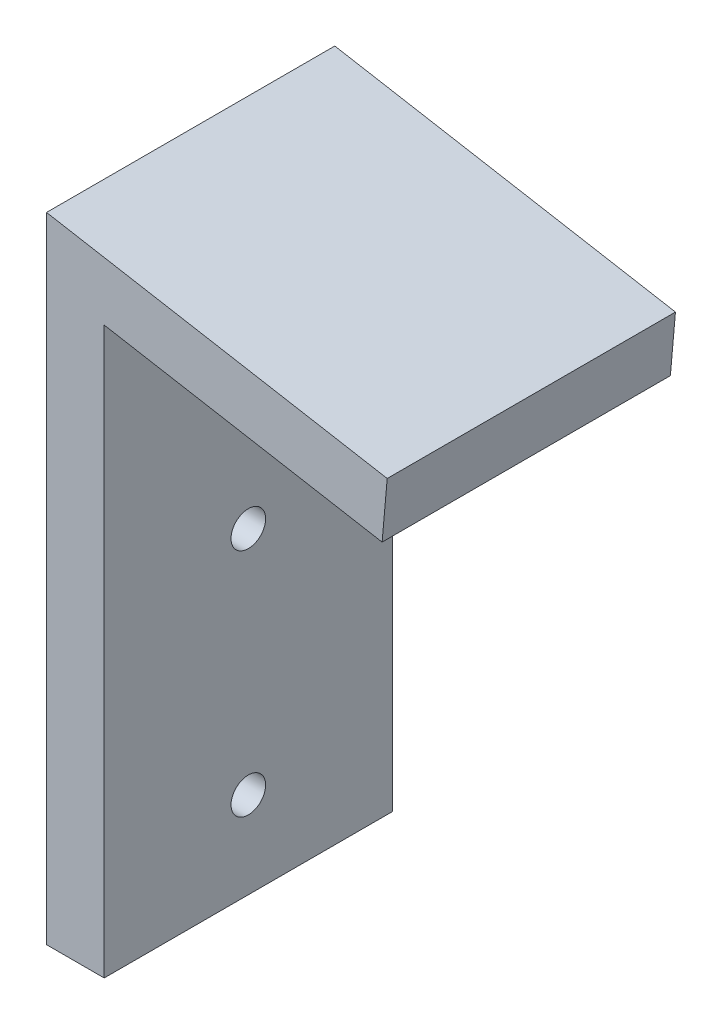
ISO-10303-21;
HEADER;
FILE_DESCRIPTION(('STEP AP214'),'2;1');
FILE_NAME('part.step','',(''),(''),'','','');
FILE_SCHEMA(('AUTOMOTIVE_DESIGN { 1 0 10303 214 1 1 1 1 }'));
ENDSEC;
DATA;
#1=APPLICATION_CONTEXT('core data for automotive mechanical design processes');
#2=APPLICATION_PROTOCOL_DEFINITION('international standard','automotive_design',2000,#1);
#3=PRODUCT_CONTEXT('',#1,'mechanical');
#4=PRODUCT('Part','Part','',(#3));
#5=PRODUCT_RELATED_PRODUCT_CATEGORY('part','',(#4));
#6=PRODUCT_DEFINITION_FORMATION('','',#4);
#7=PRODUCT_DEFINITION_CONTEXT('part definition',#1,'design');
#8=PRODUCT_DEFINITION('design','',#6,#7);
#9=PRODUCT_DEFINITION_SHAPE('','',#8);
#10=(LENGTH_UNIT() NAMED_UNIT(*) SI_UNIT(.MILLI.,.METRE.));
#11=(NAMED_UNIT(*) PLANE_ANGLE_UNIT() SI_UNIT($,.RADIAN.));
#12=(NAMED_UNIT(*) SI_UNIT($,.STERADIAN.) SOLID_ANGLE_UNIT());
#13=UNCERTAINTY_MEASURE_WITH_UNIT(LENGTH_MEASURE(1.E-05),#10,'distance_accuracy_value','');
#14=(GEOMETRIC_REPRESENTATION_CONTEXT(3) GLOBAL_UNCERTAINTY_ASSIGNED_CONTEXT((#13)) GLOBAL_UNIT_ASSIGNED_CONTEXT((#10,
#11,#12)) REPRESENTATION_CONTEXT('',''));
#15=CARTESIAN_POINT('',(0.,0.,0.));
#16=DIRECTION('',(0.,0.,1.));
#17=DIRECTION('',(1.,0.,0.));
#18=AXIS2_PLACEMENT_3D('',#15,#16,#17);
#19=CARTESIAN_POINT('',(59.0884651807324,-10.4188906600161,50.));
#20=DIRECTION('',(-0.173648177666934,-0.984807753012207,0.));
#21=DIRECTION('',(0.984807753012207,-0.173648177666934,0.));
#22=AXIS2_PLACEMENT_3D('',#19,#20,#21);
#23=PLANE('',#22);
#24=DIRECTION('',(-0.984807753012207,0.173648177666934,0.));
#25=VECTOR('',#24,1.);
#26=CARTESIAN_POINT('',(59.0884651807324,-10.4188906600161,0.));
#27=LINE('',#26,#25);
#28=CARTESIAN_POINT('',(59.0884651807324,-10.4188906600161,0.));
#29=VERTEX_POINT('',#28);
#30=CARTESIAN_POINT('',(0.,0.,0.));
#31=VERTEX_POINT('',#30);
#32=EDGE_CURVE('E120',#29,#31,#27,.T.);
#33=ORIENTED_EDGE('',*,*,#32,.T.);
#34=DIRECTION('',(0.,0.,-1.));
#35=VECTOR('',#34,1.);
#36=CARTESIAN_POINT('',(0.,0.,50.));
#37=LINE('',#36,#35);
#38=CARTESIAN_POINT('',(0.,0.,50.));
#39=VERTEX_POINT('',#38);
#40=EDGE_CURVE('E11',#39,#31,#37,.T.);
#41=ORIENTED_EDGE('',*,*,#40,.F.);
#42=DIRECTION('',(-0.984807753012207,0.173648177666934,0.));
#43=VECTOR('',#42,1.);
#44=CARTESIAN_POINT('',(59.0884651807324,-10.4188906600161,50.));
#45=LINE('',#44,#43);
#46=CARTESIAN_POINT('',(59.0884651807324,-10.4188906600161,50.));
#47=VERTEX_POINT('',#46);
#48=EDGE_CURVE('E131',#47,#39,#45,.T.);
#49=ORIENTED_EDGE('',*,*,#48,.F.);
#50=DIRECTION('',(0.,0.,-1.));
#51=VECTOR('',#50,1.);
#52=CARTESIAN_POINT('',(59.0884651807324,-10.4188906600161,50.));
#53=LINE('',#52,#51);
#54=EDGE_CURVE('E116',#47,#29,#53,.T.);
#55=ORIENTED_EDGE('',*,*,#54,.T.);
#56=EDGE_LOOP('',(#33,#41,#49,#55));
#57=FACE_BOUND('',#56,.T.);
#58=ADVANCED_FACE('F36',(#57),#23,.F.);
#59=CARTESIAN_POINT('',(0.,0.,50.));
#60=DIRECTION('',(1.,0.,0.));
#61=DIRECTION('',(0.,1.,0.));
#62=AXIS2_PLACEMENT_3D('',#59,#60,#61);
#63=PLANE('',#62);
#64=CARTESIAN_POINT('',(0.,-95.,25.));
#65=DIRECTION('',(-1.,0.,0.));
#66=DIRECTION('',(0.,-1.,0.));
#67=AXIS2_PLACEMENT_3D('',#64,#65,#66);
#68=CIRCLE('',#67,3.00000000000001);
#69=CARTESIAN_POINT('',(0.,-98.,25.));
#70=VERTEX_POINT('',#69);
#71=EDGE_CURVE('E178',#70,#70,#68,.T.);
#72=ORIENTED_EDGE('',*,*,#71,.F.);
#73=EDGE_LOOP('',(#72));
#74=FACE_BOUND('',#73,.T.);
#75=CARTESIAN_POINT('',(0.,-55.,25.));
#76=DIRECTION('',(-1.,0.,0.));
#77=DIRECTION('',(0.,-1.,0.));
#78=AXIS2_PLACEMENT_3D('',#75,#76,#77);
#79=CIRCLE('',#78,3.00000000000001);
#80=CARTESIAN_POINT('',(0.,-58.,25.));
#81=VERTEX_POINT('',#80);
#82=EDGE_CURVE('E179',#81,#81,#79,.T.);
#83=ORIENTED_EDGE('',*,*,#82,.F.);
#84=EDGE_LOOP('',(#83));
#85=FACE_BOUND('',#84,.T.);
#86=DIRECTION('',(0.,-1.,0.));
#87=VECTOR('',#86,1.);
#88=CARTESIAN_POINT('',(0.,0.,0.));
#89=LINE('',#88,#87);
#90=CARTESIAN_POINT('',(0.,-110.,0.));
#91=VERTEX_POINT('',#90);
#92=EDGE_CURVE('E123',#31,#91,#89,.T.);
#93=ORIENTED_EDGE('',*,*,#92,.T.);
#94=DIRECTION('',(0.,0.,-1.));
#95=VECTOR('',#94,1.);
#96=CARTESIAN_POINT('',(0.,-110.,50.));
#97=LINE('',#96,#95);
#98=CARTESIAN_POINT('',(0.,-110.,50.));
#99=VERTEX_POINT('',#98);
#100=EDGE_CURVE('E44',#99,#91,#97,.T.);
#101=ORIENTED_EDGE('',*,*,#100,.F.);
#102=DIRECTION('',(0.,-1.,0.));
#103=VECTOR('',#102,1.);
#104=CARTESIAN_POINT('',(0.,0.,50.));
#105=LINE('',#104,#103);
#106=EDGE_CURVE('E89',#39,#99,#105,.T.);
#107=ORIENTED_EDGE('',*,*,#106,.F.);
#108=ORIENTED_EDGE('',*,*,#40,.T.);
#109=EDGE_LOOP('',(#93,#101,#107,#108));
#110=FACE_BOUND('',#109,.T.);
#111=ADVANCED_FACE('F155',(#74,#85,#110),#63,.F.);
#112=CARTESIAN_POINT('',(0.,-110.,50.));
#113=DIRECTION('',(0.,1.,0.));
#114=DIRECTION('',(0.,0.,1.));
#115=AXIS2_PLACEMENT_3D('',#112,#113,#114);
#116=PLANE('',#115);
#117=DIRECTION('',(1.,0.,0.));
#118=VECTOR('',#117,1.);
#119=CARTESIAN_POINT('',(0.,-110.,0.));
#120=LINE('',#119,#118);
#121=CARTESIAN_POINT('',(10.,-110.,0.));
#122=VERTEX_POINT('',#121);
#123=EDGE_CURVE('E126',#91,#122,#120,.T.);
#124=ORIENTED_EDGE('',*,*,#123,.T.);
#125=DIRECTION('',(0.,0.,-1.));
#126=VECTOR('',#125,1.);
#127=CARTESIAN_POINT('',(10.,-110.,50.));
#128=LINE('',#127,#126);
#129=CARTESIAN_POINT('',(10.,-110.,50.));
#130=VERTEX_POINT('',#129);
#131=EDGE_CURVE('E111',#130,#122,#128,.T.);
#132=ORIENTED_EDGE('',*,*,#131,.F.);
#133=DIRECTION('',(1.,0.,0.));
#134=VECTOR('',#133,1.);
#135=CARTESIAN_POINT('',(0.,-110.,50.));
#136=LINE('',#135,#134);
#137=EDGE_CURVE('E102',#99,#130,#136,.T.);
#138=ORIENTED_EDGE('',*,*,#137,.F.);
#139=ORIENTED_EDGE('',*,*,#100,.T.);
#140=EDGE_LOOP('',(#124,#132,#138,#139));
#141=FACE_BOUND('',#140,.T.);
#142=ADVANCED_FACE('F137',(#141),#116,.F.);
#143=CARTESIAN_POINT('',(10.,-110.,50.));
#144=DIRECTION('',(-1.,0.,0.));
#145=DIRECTION('',(0.,0.,1.));
#146=AXIS2_PLACEMENT_3D('',#143,#144,#145);
#147=PLANE('',#146);
#148=CARTESIAN_POINT('',(10.,-95.,25.));
#149=DIRECTION('',(-1.,0.,0.));
#150=DIRECTION('',(0.,-1.,0.));
#151=AXIS2_PLACEMENT_3D('',#148,#149,#150);
#152=CIRCLE('',#151,3.00000000000001);
#153=CARTESIAN_POINT('',(10.,-98.,25.));
#154=VERTEX_POINT('',#153);
#155=EDGE_CURVE('E124',#154,#154,#152,.T.);
#156=ORIENTED_EDGE('',*,*,#155,.T.);
#157=EDGE_LOOP('',(#156));
#158=FACE_BOUND('',#157,.T.);
#159=CARTESIAN_POINT('',(10.,-55.,25.));
#160=DIRECTION('',(-1.,0.,0.));
#161=DIRECTION('',(0.,-1.,0.));
#162=AXIS2_PLACEMENT_3D('',#159,#160,#161);
#163=CIRCLE('',#162,3.00000000000001);
#164=CARTESIAN_POINT('',(10.,-58.,25.));
#165=VERTEX_POINT('',#164);
#166=EDGE_CURVE('E176',#165,#165,#163,.T.);
#167=ORIENTED_EDGE('',*,*,#166,.T.);
#168=EDGE_LOOP('',(#167));
#169=FACE_BOUND('',#168,.T.);
#170=DIRECTION('',(0.,1.,0.));
#171=VECTOR('',#170,1.);
#172=CARTESIAN_POINT('',(10.,-110.,0.));
#173=LINE('',#172,#171);
#174=CARTESIAN_POINT('',(10.,-11.9175359259421,0.));
#175=VERTEX_POINT('',#174);
#176=EDGE_CURVE('E110',#122,#175,#173,.T.);
#177=ORIENTED_EDGE('',*,*,#176,.T.);
#178=DIRECTION('',(0.,0.,-1.));
#179=VECTOR('',#178,1.);
#180=CARTESIAN_POINT('',(10.,-11.9175359259421,50.));
#181=LINE('',#180,#179);
#182=CARTESIAN_POINT('',(10.,-11.9175359259421,50.));
#183=VERTEX_POINT('',#182);
#184=EDGE_CURVE('E107',#183,#175,#181,.T.);
#185=ORIENTED_EDGE('',*,*,#184,.F.);
#186=DIRECTION('',(0.,1.,0.));
#187=VECTOR('',#186,1.);
#188=CARTESIAN_POINT('',(10.,-110.,50.));
#189=LINE('',#188,#187);
#190=EDGE_CURVE('E96',#130,#183,#189,.T.);
#191=ORIENTED_EDGE('',*,*,#190,.F.);
#192=ORIENTED_EDGE('',*,*,#131,.T.);
#193=EDGE_LOOP('',(#177,#185,#191,#192));
#194=FACE_BOUND('',#193,.T.);
#195=ADVANCED_FACE('F108',(#158,#169,#194),#147,.F.);
#196=CARTESIAN_POINT('',(10.,-11.9175359259421,50.));
#197=DIRECTION('',(0.173648177666934,0.984807753012207,0.));
#198=DIRECTION('',(-0.984807753012207,0.173648177666934,0.));
#199=AXIS2_PLACEMENT_3D('',#196,#197,#198);
#200=PLANE('',#199);
#201=DIRECTION('',(0.984807753012207,-0.173648177666934,0.));
#202=VECTOR('',#201,1.);
#203=CARTESIAN_POINT('',(10.,-11.9175359259421,0.));
#204=LINE('',#203,#202);
#205=CARTESIAN_POINT('',(58.2067579185494,-20.417687999464,0.));
#206=VERTEX_POINT('',#205);
#207=EDGE_CURVE('E75',#175,#206,#204,.T.);
#208=ORIENTED_EDGE('',*,*,#207,.T.);
#209=DIRECTION('',(0.,0.,-1.));
#210=VECTOR('',#209,1.);
#211=CARTESIAN_POINT('',(58.2067579185494,-20.417687999464,50.));
#212=LINE('',#211,#210);
#213=CARTESIAN_POINT('',(58.2067579185494,-20.417687999464,50.));
#214=VERTEX_POINT('',#213);
#215=EDGE_CURVE('E112',#214,#206,#212,.T.);
#216=ORIENTED_EDGE('',*,*,#215,.F.);
#217=DIRECTION('',(0.984807753012207,-0.173648177666934,0.));
#218=VECTOR('',#217,1.);
#219=CARTESIAN_POINT('',(10.,-11.9175359259421,50.));
#220=LINE('',#219,#218);
#221=EDGE_CURVE('E100',#183,#214,#220,.T.);
#222=ORIENTED_EDGE('',*,*,#221,.F.);
#223=ORIENTED_EDGE('',*,*,#184,.T.);
#224=EDGE_LOOP('',(#208,#216,#222,#223));
#225=FACE_BOUND('',#224,.T.);
#226=ADVANCED_FACE('F114',(#225),#200,.F.);
#227=CARTESIAN_POINT('',(58.2067579185494,-20.417687999464,50.));
#228=DIRECTION('',(-0.996134554963904,0.0878404713492907,0.));
#229=DIRECTION('',(-0.0878404713492907,-0.996134554963904,0.));
#230=AXIS2_PLACEMENT_3D('',#227,#228,#229);
#231=PLANE('',#230);
#232=DIRECTION('',(0.0878404713492907,0.996134554963904,0.));
#233=VECTOR('',#232,1.);
#234=CARTESIAN_POINT('',(58.2067579185494,-20.417687999464,0.));
#235=LINE('',#234,#233);
#236=EDGE_CURVE('E81',#206,#29,#235,.T.);
#237=ORIENTED_EDGE('',*,*,#236,.T.);
#238=ORIENTED_EDGE('',*,*,#54,.F.);
#239=DIRECTION('',(0.0878404713492907,0.996134554963904,0.));
#240=VECTOR('',#239,1.);
#241=CARTESIAN_POINT('',(58.2067579185494,-20.417687999464,50.));
#242=LINE('',#241,#240);
#243=EDGE_CURVE('E52',#214,#47,#242,.T.);
#244=ORIENTED_EDGE('',*,*,#243,.F.);
#245=ORIENTED_EDGE('',*,*,#215,.T.);
#246=EDGE_LOOP('',(#237,#238,#244,#245));
#247=FACE_BOUND('',#246,.T.);
#248=ADVANCED_FACE('F144',(#247),#231,.F.);
#249=CARTESIAN_POINT('',(0.,0.,50.));
#250=DIRECTION('',(0.,0.,-1.));
#251=DIRECTION('',(-1.,0.,0.));
#252=AXIS2_PLACEMENT_3D('',#249,#250,#251);
#253=PLANE('',#252);
#254=ORIENTED_EDGE('',*,*,#48,.T.);
#255=ORIENTED_EDGE('',*,*,#106,.T.);
#256=ORIENTED_EDGE('',*,*,#137,.T.);
#257=ORIENTED_EDGE('',*,*,#190,.T.);
#258=ORIENTED_EDGE('',*,*,#221,.T.);
#259=ORIENTED_EDGE('',*,*,#243,.T.);
#260=EDGE_LOOP('',(#254,#255,#256,#257,#258,#259));
#261=FACE_BOUND('',#260,.T.);
#262=ADVANCED_FACE('F98',(#261),#253,.F.);
#263=CARTESIAN_POINT('',(0.,0.,0.));
#264=DIRECTION('',(0.,0.,-1.));
#265=DIRECTION('',(-1.,0.,0.));
#266=AXIS2_PLACEMENT_3D('',#263,#264,#265);
#267=PLANE('',#266);
#268=ORIENTED_EDGE('',*,*,#32,.F.);
#269=ORIENTED_EDGE('',*,*,#236,.F.);
#270=ORIENTED_EDGE('',*,*,#207,.F.);
#271=ORIENTED_EDGE('',*,*,#176,.F.);
#272=ORIENTED_EDGE('',*,*,#123,.F.);
#273=ORIENTED_EDGE('',*,*,#92,.F.);
#274=EDGE_LOOP('',(#268,#269,#270,#271,#272,#273));
#275=FACE_BOUND('',#274,.T.);
#276=ADVANCED_FACE('F140',(#275),#267,.T.);
#277=CARTESIAN_POINT('',(10.,-55.,25.));
#278=DIRECTION('',(-1.,0.,0.));
#279=DIRECTION('',(0.,-1.,0.));
#280=AXIS2_PLACEMENT_3D('',#277,#278,#279);
#281=CYLINDRICAL_SURFACE('',#280,3.00000000000001);
#282=ORIENTED_EDGE('',*,*,#166,.F.);
#283=EDGE_LOOP('',(#282));
#284=FACE_BOUND('',#283,.T.);
#285=ORIENTED_EDGE('',*,*,#82,.T.);
#286=EDGE_LOOP('',(#285));
#287=FACE_BOUND('',#286,.T.);
#288=ADVANCED_FACE('F190',(#284,#287),#281,.F.);
#289=CARTESIAN_POINT('',(10.,-95.,25.));
#290=DIRECTION('',(-1.,0.,0.));
#291=DIRECTION('',(0.,-1.,0.));
#292=AXIS2_PLACEMENT_3D('',#289,#290,#291);
#293=CYLINDRICAL_SURFACE('',#292,3.00000000000001);
#294=ORIENTED_EDGE('',*,*,#155,.F.);
#295=EDGE_LOOP('',(#294));
#296=FACE_BOUND('',#295,.T.);
#297=ORIENTED_EDGE('',*,*,#71,.T.);
#298=EDGE_LOOP('',(#297));
#299=FACE_BOUND('',#298,.T.);
#300=ADVANCED_FACE('F192',(#296,#299),#293,.F.);
#301=CLOSED_SHELL('',(#58,#111,#142,#195,#226,#248,#262,#276,#288,#300));
#302=MANIFOLD_SOLID_BREP('B2',#301);
#303=ADVANCED_BREP_SHAPE_REPRESENTATION('',(#18,#302),#14);
#304=SHAPE_DEFINITION_REPRESENTATION(#9,#303);
ENDSEC;
END-ISO-10303-21;
